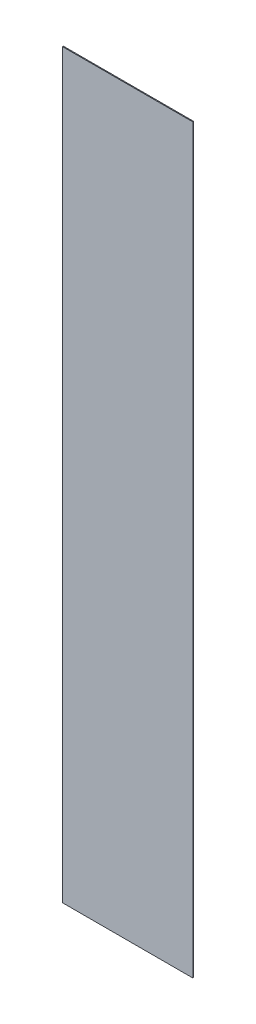
ISO-10303-21;
HEADER;
FILE_DESCRIPTION(('STEP AP214'),'2;1');
FILE_NAME('part.step','',(''),(''),'','','');
FILE_SCHEMA(('AUTOMOTIVE_DESIGN { 1 0 10303 214 1 1 1 1 }'));
ENDSEC;
DATA;
#1=APPLICATION_CONTEXT('core data for automotive mechanical design processes');
#2=APPLICATION_PROTOCOL_DEFINITION('international standard','automotive_design',2000,#1);
#3=PRODUCT_CONTEXT('',#1,'mechanical');
#4=PRODUCT('Part','Part','',(#3));
#5=PRODUCT_RELATED_PRODUCT_CATEGORY('part','',(#4));
#6=PRODUCT_DEFINITION_FORMATION('','',#4);
#7=PRODUCT_DEFINITION_CONTEXT('part definition',#1,'design');
#8=PRODUCT_DEFINITION('design','',#6,#7);
#9=PRODUCT_DEFINITION_SHAPE('','',#8);
#10=(LENGTH_UNIT() NAMED_UNIT(*) SI_UNIT(.MILLI.,.METRE.));
#11=(NAMED_UNIT(*) PLANE_ANGLE_UNIT() SI_UNIT($,.RADIAN.));
#12=(NAMED_UNIT(*) SI_UNIT($,.STERADIAN.) SOLID_ANGLE_UNIT());
#13=UNCERTAINTY_MEASURE_WITH_UNIT(LENGTH_MEASURE(1.E-05),#10,'distance_accuracy_value','');
#14=(GEOMETRIC_REPRESENTATION_CONTEXT(3) GLOBAL_UNCERTAINTY_ASSIGNED_CONTEXT((#13)) GLOBAL_UNIT_ASSIGNED_CONTEXT((#10,
#11,#12)) REPRESENTATION_CONTEXT('',''));
#15=CARTESIAN_POINT('',(0.,0.,0.));
#16=DIRECTION('',(0.,0.,1.));
#17=DIRECTION('',(1.,0.,0.));
#18=AXIS2_PLACEMENT_3D('',#15,#16,#17);
#19=CARTESIAN_POINT('',(0.,0.,3.));
#20=DIRECTION('',(1.,0.,0.));
#21=DIRECTION('',(0.,0.,-1.));
#22=AXIS2_PLACEMENT_3D('',#19,#20,#21);
#23=PLANE('',#22);
#24=DIRECTION('',(0.,-1.,0.));
#25=VECTOR('',#24,1.);
#26=CARTESIAN_POINT('',(0.,0.,0.));
#27=LINE('',#26,#25);
#28=CARTESIAN_POINT('',(0.,2500.,0.));
#29=VERTEX_POINT('',#28);
#30=CARTESIAN_POINT('',(0.,0.,0.));
#31=VERTEX_POINT('',#30);
#32=EDGE_CURVE('E96',#29,#31,#27,.T.);
#33=ORIENTED_EDGE('',*,*,#32,.T.);
#34=DIRECTION('',(0.,0.,-1.));
#35=VECTOR('',#34,1.);
#36=CARTESIAN_POINT('',(0.,0.,3.));
#37=LINE('',#36,#35);
#38=CARTESIAN_POINT('',(0.,0.,3.));
#39=VERTEX_POINT('',#38);
#40=EDGE_CURVE('E11',#39,#31,#37,.T.);
#41=ORIENTED_EDGE('',*,*,#40,.F.);
#42=DIRECTION('',(0.,-1.,0.));
#43=VECTOR('',#42,1.);
#44=CARTESIAN_POINT('',(0.,0.,3.));
#45=LINE('',#44,#43);
#46=CARTESIAN_POINT('',(0.,2500.,3.));
#47=VERTEX_POINT('',#46);
#48=EDGE_CURVE('E84',#47,#39,#45,.T.);
#49=ORIENTED_EDGE('',*,*,#48,.F.);
#50=DIRECTION('',(0.,0.,-1.));
#51=VECTOR('',#50,1.);
#52=CARTESIAN_POINT('',(0.,2500.,3.));
#53=LINE('',#52,#51);
#54=EDGE_CURVE('E92',#47,#29,#53,.T.);
#55=ORIENTED_EDGE('',*,*,#54,.T.);
#56=EDGE_LOOP('',(#33,#41,#49,#55));
#57=FACE_BOUND('',#56,.T.);
#58=ADVANCED_FACE('F33',(#57),#23,.F.);
#59=CARTESIAN_POINT('',(0.,0.,3.));
#60=DIRECTION('',(0.,1.,0.));
#61=DIRECTION('',(0.,0.,1.));
#62=AXIS2_PLACEMENT_3D('',#59,#60,#61);
#63=PLANE('',#62);
#64=DIRECTION('',(1.,0.,0.));
#65=VECTOR('',#64,1.);
#66=CARTESIAN_POINT('',(0.,0.,0.));
#67=LINE('',#66,#65);
#68=CARTESIAN_POINT('',(440.,0.,0.));
#69=VERTEX_POINT('',#68);
#70=EDGE_CURVE('E88',#31,#69,#67,.T.);
#71=ORIENTED_EDGE('',*,*,#70,.T.);
#72=DIRECTION('',(0.,0.,-1.));
#73=VECTOR('',#72,1.);
#74=CARTESIAN_POINT('',(440.,0.,3.));
#75=LINE('',#74,#73);
#76=CARTESIAN_POINT('',(440.,0.,3.));
#77=VERTEX_POINT('',#76);
#78=EDGE_CURVE('E41',#77,#69,#75,.T.);
#79=ORIENTED_EDGE('',*,*,#78,.F.);
#80=DIRECTION('',(1.,0.,0.));
#81=VECTOR('',#80,1.);
#82=CARTESIAN_POINT('',(0.,0.,3.));
#83=LINE('',#82,#81);
#84=EDGE_CURVE('E79',#39,#77,#83,.T.);
#85=ORIENTED_EDGE('',*,*,#84,.F.);
#86=ORIENTED_EDGE('',*,*,#40,.T.);
#87=EDGE_LOOP('',(#71,#79,#85,#86));
#88=FACE_BOUND('',#87,.T.);
#89=ADVANCED_FACE('F87',(#88),#63,.F.);
#90=CARTESIAN_POINT('',(440.,0.,3.));
#91=DIRECTION('',(-1.,0.,0.));
#92=DIRECTION('',(0.,0.,1.));
#93=AXIS2_PLACEMENT_3D('',#90,#91,#92);
#94=PLANE('',#93);
#95=DIRECTION('',(0.,1.,0.));
#96=VECTOR('',#95,1.);
#97=CARTESIAN_POINT('',(440.,0.,0.));
#98=LINE('',#97,#96);
#99=CARTESIAN_POINT('',(440.,2500.,0.));
#100=VERTEX_POINT('',#99);
#101=EDGE_CURVE('E66',#69,#100,#98,.T.);
#102=ORIENTED_EDGE('',*,*,#101,.T.);
#103=DIRECTION('',(0.,0.,-1.));
#104=VECTOR('',#103,1.);
#105=CARTESIAN_POINT('',(440.,2500.,3.));
#106=LINE('',#105,#104);
#107=CARTESIAN_POINT('',(440.,2500.,3.));
#108=VERTEX_POINT('',#107);
#109=EDGE_CURVE('E89',#108,#100,#106,.T.);
#110=ORIENTED_EDGE('',*,*,#109,.F.);
#111=DIRECTION('',(0.,1.,0.));
#112=VECTOR('',#111,1.);
#113=CARTESIAN_POINT('',(440.,0.,3.));
#114=LINE('',#113,#112);
#115=EDGE_CURVE('E82',#77,#108,#114,.T.);
#116=ORIENTED_EDGE('',*,*,#115,.F.);
#117=ORIENTED_EDGE('',*,*,#78,.T.);
#118=EDGE_LOOP('',(#102,#110,#116,#117));
#119=FACE_BOUND('',#118,.T.);
#120=ADVANCED_FACE('F90',(#119),#94,.F.);
#121=CARTESIAN_POINT('',(0.,2500.,3.));
#122=DIRECTION('',(0.,-1.,0.));
#123=DIRECTION('',(0.,0.,-1.));
#124=AXIS2_PLACEMENT_3D('',#121,#122,#123);
#125=PLANE('',#124);
#126=DIRECTION('',(-1.,0.,0.));
#127=VECTOR('',#126,1.);
#128=CARTESIAN_POINT('',(0.,2500.,0.));
#129=LINE('',#128,#127);
#130=EDGE_CURVE('E72',#100,#29,#129,.T.);
#131=ORIENTED_EDGE('',*,*,#130,.T.);
#132=ORIENTED_EDGE('',*,*,#54,.F.);
#133=DIRECTION('',(-1.,0.,0.));
#134=VECTOR('',#133,1.);
#135=CARTESIAN_POINT('',(0.,2500.,3.));
#136=LINE('',#135,#134);
#137=EDGE_CURVE('E49',#108,#47,#136,.T.);
#138=ORIENTED_EDGE('',*,*,#137,.F.);
#139=ORIENTED_EDGE('',*,*,#109,.T.);
#140=EDGE_LOOP('',(#131,#132,#138,#139));
#141=FACE_BOUND('',#140,.T.);
#142=ADVANCED_FACE('F103',(#141),#125,.F.);
#143=CARTESIAN_POINT('',(0.,0.,3.));
#144=DIRECTION('',(0.,0.,-1.));
#145=DIRECTION('',(-1.,0.,0.));
#146=AXIS2_PLACEMENT_3D('',#143,#144,#145);
#147=PLANE('',#146);
#148=ORIENTED_EDGE('',*,*,#48,.T.);
#149=ORIENTED_EDGE('',*,*,#84,.T.);
#150=ORIENTED_EDGE('',*,*,#115,.T.);
#151=ORIENTED_EDGE('',*,*,#137,.T.);
#152=EDGE_LOOP('',(#148,#149,#150,#151));
#153=FACE_BOUND('',#152,.T.);
#154=ADVANCED_FACE('F80',(#153),#147,.F.);
#155=CARTESIAN_POINT('',(0.,0.,0.));
#156=DIRECTION('',(0.,0.,-1.));
#157=DIRECTION('',(-1.,0.,0.));
#158=AXIS2_PLACEMENT_3D('',#155,#156,#157);
#159=PLANE('',#158);
#160=ORIENTED_EDGE('',*,*,#32,.F.);
#161=ORIENTED_EDGE('',*,*,#130,.F.);
#162=ORIENTED_EDGE('',*,*,#101,.F.);
#163=ORIENTED_EDGE('',*,*,#70,.F.);
#164=EDGE_LOOP('',(#160,#161,#162,#163));
#165=FACE_BOUND('',#164,.T.);
#166=ADVANCED_FACE('F106',(#165),#159,.T.);
#167=CLOSED_SHELL('',(#58,#89,#120,#142,#154,#166));
#168=MANIFOLD_SOLID_BREP('B2',#167);
#169=ADVANCED_BREP_SHAPE_REPRESENTATION('',(#18,#168),#14);
#170=SHAPE_DEFINITION_REPRESENTATION(#9,#169);
ENDSEC;
END-ISO-10303-21;
